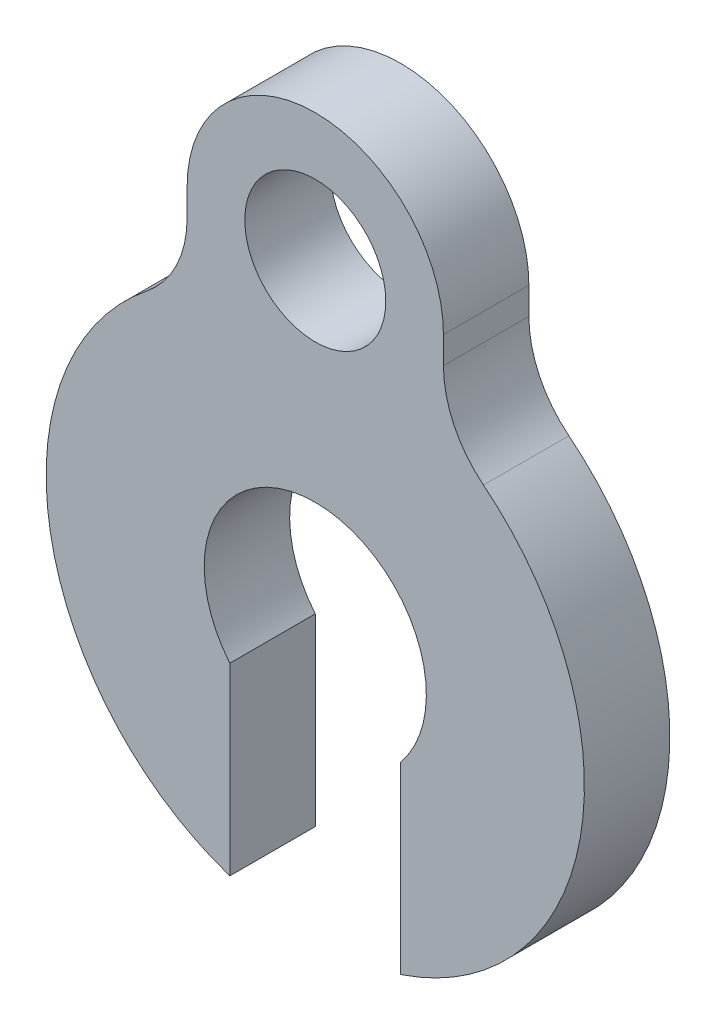
ISO-10303-21;
HEADER;
FILE_DESCRIPTION(('STEP AP214'),'2;1');
FILE_NAME('part.step','',(''),(''),'','','');
FILE_SCHEMA(('AUTOMOTIVE_DESIGN { 1 0 10303 214 1 1 1 1 }'));
ENDSEC;
DATA;
#1=APPLICATION_CONTEXT('core data for automotive mechanical design processes');
#2=APPLICATION_PROTOCOL_DEFINITION('international standard','automotive_design',2000,#1);
#3=PRODUCT_CONTEXT('',#1,'mechanical');
#4=PRODUCT('Part','Part','',(#3));
#5=PRODUCT_RELATED_PRODUCT_CATEGORY('part','',(#4));
#6=PRODUCT_DEFINITION_FORMATION('','',#4);
#7=PRODUCT_DEFINITION_CONTEXT('part definition',#1,'design');
#8=PRODUCT_DEFINITION('design','',#6,#7);
#9=PRODUCT_DEFINITION_SHAPE('','',#8);
#10=(LENGTH_UNIT() NAMED_UNIT(*) SI_UNIT(.MILLI.,.METRE.));
#11=(NAMED_UNIT(*) PLANE_ANGLE_UNIT() SI_UNIT($,.RADIAN.));
#12=(NAMED_UNIT(*) SI_UNIT($,.STERADIAN.) SOLID_ANGLE_UNIT());
#13=UNCERTAINTY_MEASURE_WITH_UNIT(LENGTH_MEASURE(1.E-05),#10,'distance_accuracy_value','');
#14=(GEOMETRIC_REPRESENTATION_CONTEXT(3) GLOBAL_UNCERTAINTY_ASSIGNED_CONTEXT((#13)) GLOBAL_UNIT_ASSIGNED_CONTEXT((#10,
#11,#12)) REPRESENTATION_CONTEXT('',''));
#15=CARTESIAN_POINT('',(0.,0.,0.));
#16=DIRECTION('',(0.,0.,1.));
#17=DIRECTION('',(1.,0.,0.));
#18=AXIS2_PLACEMENT_3D('',#15,#16,#17);
#19=CARTESIAN_POINT('',(-1.27,0.,0.635));
#20=DIRECTION('',(-1.,0.,0.));
#21=DIRECTION('',(0.,0.,1.));
#22=AXIS2_PLACEMENT_3D('',#19,#20,#21);
#23=PLANE('',#22);
#24=DIRECTION('',(0.,1.,0.));
#25=VECTOR('',#24,1.);
#26=CARTESIAN_POINT('',(-1.27,0.,-0.635));
#27=LINE('',#26,#25);
#28=CARTESIAN_POINT('',(-1.27,-3.79356036593594,-0.635));
#29=VERTEX_POINT('',#28);
#30=CARTESIAN_POINT('',(-1.27,-1.05494123059059,-0.635));
#31=VERTEX_POINT('',#30);
#32=EDGE_CURVE('E137',#29,#31,#27,.T.);
#33=ORIENTED_EDGE('',*,*,#32,.T.);
#34=DIRECTION('',(0.,0.,-1.));
#35=VECTOR('',#34,1.);
#36=CARTESIAN_POINT('',(-1.27,-1.05494123059059,0.635));
#37=LINE('',#36,#35);
#38=CARTESIAN_POINT('',(-1.27,-1.05494123059059,0.635));
#39=VERTEX_POINT('',#38);
#40=EDGE_CURVE('E118',#39,#31,#37,.T.);
#41=ORIENTED_EDGE('',*,*,#40,.F.);
#42=DIRECTION('',(0.,1.,0.));
#43=VECTOR('',#42,1.);
#44=CARTESIAN_POINT('',(-1.27,0.,0.635));
#45=LINE('',#44,#43);
#46=CARTESIAN_POINT('',(-1.27,-3.79356036593594,0.635));
#47=VERTEX_POINT('',#46);
#48=EDGE_CURVE('E125',#47,#39,#45,.T.);
#49=ORIENTED_EDGE('',*,*,#48,.F.);
#50=DIRECTION('',(0.,0.,-1.));
#51=VECTOR('',#50,1.);
#52=CARTESIAN_POINT('',(-1.27,-3.79356036593594,0.635));
#53=LINE('',#52,#51);
#54=EDGE_CURVE('E165',#47,#29,#53,.T.);
#55=ORIENTED_EDGE('',*,*,#54,.T.);
#56=EDGE_LOOP('',(#33,#41,#49,#55));
#57=FACE_BOUND('',#56,.T.);
#58=ADVANCED_FACE('F38',(#57),#23,.F.);
#59=CARTESIAN_POINT('',(0.,0.,0.635));
#60=DIRECTION('',(0.,0.,-1.));
#61=DIRECTION('',(-1.,0.,0.));
#62=AXIS2_PLACEMENT_3D('',#59,#60,#61);
#63=CYLINDRICAL_SURFACE('',#62,1.651);
#64=CARTESIAN_POINT('',(0.,0.,-0.635));
#65=DIRECTION('',(0.,0.,1.));
#66=DIRECTION('',(1.,0.,0.));
#67=AXIS2_PLACEMENT_3D('',#64,#65,#66);
#68=CIRCLE('',#67,1.651);
#69=CARTESIAN_POINT('',(1.27000000000001,-1.05494123059059,-0.635));
#70=VERTEX_POINT('',#69);
#71=EDGE_CURVE('E199',#31,#70,#68,.F.);
#72=ORIENTED_EDGE('',*,*,#71,.T.);
#73=DIRECTION('',(0.,0.,-1.));
#74=VECTOR('',#73,1.);
#75=CARTESIAN_POINT('',(1.27000000000001,-1.05494123059059,0.635));
#76=LINE('',#75,#74);
#77=CARTESIAN_POINT('',(1.27000000000001,-1.05494123059059,0.635));
#78=VERTEX_POINT('',#77);
#79=EDGE_CURVE('E120',#78,#70,#76,.T.);
#80=ORIENTED_EDGE('',*,*,#79,.F.);
#81=CARTESIAN_POINT('',(0.,0.,0.635));
#82=DIRECTION('',(0.,0.,1.));
#83=DIRECTION('',(1.,0.,0.));
#84=AXIS2_PLACEMENT_3D('',#81,#82,#83);
#85=CIRCLE('',#84,1.651);
#86=EDGE_CURVE('E113',#39,#78,#85,.F.);
#87=ORIENTED_EDGE('',*,*,#86,.F.);
#88=ORIENTED_EDGE('',*,*,#40,.T.);
#89=EDGE_LOOP('',(#72,#80,#87,#88));
#90=FACE_BOUND('',#89,.T.);
#91=ADVANCED_FACE('F116',(#90),#63,.F.);
#92=CARTESIAN_POINT('',(1.27,0.,0.635));
#93=DIRECTION('',(-1.,0.,0.));
#94=DIRECTION('',(0.,-1.,0.));
#95=AXIS2_PLACEMENT_3D('',#92,#93,#94);
#96=PLANE('',#95);
#97=DIRECTION('',(0.,1.,0.));
#98=VECTOR('',#97,1.);
#99=CARTESIAN_POINT('',(1.27,0.,-0.635));
#100=LINE('',#99,#98);
#101=CARTESIAN_POINT('',(1.27000000000003,-3.79356036593594,-0.635));
#102=VERTEX_POINT('',#101);
#103=EDGE_CURVE('E197',#102,#70,#100,.T.);
#104=ORIENTED_EDGE('',*,*,#103,.F.);
#105=DIRECTION('',(0.,0.,-1.));
#106=VECTOR('',#105,1.);
#107=CARTESIAN_POINT('',(1.27000000000003,-3.79356036593594,0.635));
#108=LINE('',#107,#106);
#109=CARTESIAN_POINT('',(1.27000000000003,-3.79356036593594,0.635));
#110=VERTEX_POINT('',#109);
#111=EDGE_CURVE('E143',#110,#102,#108,.T.);
#112=ORIENTED_EDGE('',*,*,#111,.F.);
#113=DIRECTION('',(0.,1.,0.));
#114=VECTOR('',#113,1.);
#115=CARTESIAN_POINT('',(1.27,0.,0.635));
#116=LINE('',#115,#114);
#117=EDGE_CURVE('E124',#110,#78,#116,.T.);
#118=ORIENTED_EDGE('',*,*,#117,.T.);
#119=ORIENTED_EDGE('',*,*,#79,.T.);
#120=EDGE_LOOP('',(#104,#112,#118,#119));
#121=FACE_BOUND('',#120,.T.);
#122=ADVANCED_FACE('F198',(#121),#96,.T.);
#123=CARTESIAN_POINT('',(0.,0.,0.635));
#124=DIRECTION('',(0.,0.,-1.));
#125=DIRECTION('',(-1.,0.,0.));
#126=AXIS2_PLACEMENT_3D('',#123,#124,#125);
#127=CYLINDRICAL_SURFACE('',#126,4.0005);
#128=CARTESIAN_POINT('',(0.,0.,-0.635));
#129=DIRECTION('',(0.,0.,1.));
#130=DIRECTION('',(1.,0.,0.));
#131=AXIS2_PLACEMENT_3D('',#128,#129,#130);
#132=CIRCLE('',#131,4.0005);
#133=CARTESIAN_POINT('',(2.5003125,3.1228893115741,-0.635));
#134=VERTEX_POINT('',#133);
#135=EDGE_CURVE('E193',#134,#102,#132,.F.);
#136=ORIENTED_EDGE('',*,*,#135,.F.);
#137=DIRECTION('',(0.,0.,-1.));
#138=VECTOR('',#137,1.);
#139=CARTESIAN_POINT('',(2.5003125,3.1228893115741,0.635));
#140=LINE('',#139,#138);
#141=CARTESIAN_POINT('',(2.5003125,3.1228893115741,0.635));
#142=VERTEX_POINT('',#141);
#143=EDGE_CURVE('E53',#134,#142,#140,.F.);
#144=ORIENTED_EDGE('',*,*,#143,.T.);
#145=CARTESIAN_POINT('',(0.,0.,0.635));
#146=DIRECTION('',(0.,0.,1.));
#147=DIRECTION('',(1.,0.,0.));
#148=AXIS2_PLACEMENT_3D('',#145,#146,#147);
#149=CIRCLE('',#148,4.0005);
#150=EDGE_CURVE('E194',#142,#110,#149,.F.);
#151=ORIENTED_EDGE('',*,*,#150,.T.);
#152=ORIENTED_EDGE('',*,*,#111,.T.);
#153=EDGE_LOOP('',(#136,#144,#151,#152));
#154=FACE_BOUND('',#153,.T.);
#155=ADVANCED_FACE('F192',(#154),#127,.T.);
#156=CARTESIAN_POINT('',(1.905,0.,0.635));
#157=DIRECTION('',(1.,0.,0.));
#158=DIRECTION('',(0.,0.,-1.));
#159=AXIS2_PLACEMENT_3D('',#156,#157,#158);
#160=PLANE('',#159);
#161=DIRECTION('',(0.,-1.,0.));
#162=VECTOR('',#161,1.);
#163=CARTESIAN_POINT('',(1.905,0.,0.635));
#164=LINE('',#163,#162);
#165=CARTESIAN_POINT('',(1.905,4.7625,0.635));
#166=VERTEX_POINT('',#165);
#167=CARTESIAN_POINT('',(1.905,4.36213110188129,0.635));
#168=VERTEX_POINT('',#167);
#169=EDGE_CURVE('E210',#166,#168,#164,.T.);
#170=ORIENTED_EDGE('',*,*,#169,.T.);
#171=DIRECTION('',(0.,0.,1.));
#172=VECTOR('',#171,1.);
#173=CARTESIAN_POINT('',(1.905,4.36213110188129,-0.635));
#174=LINE('',#173,#172);
#175=CARTESIAN_POINT('',(1.905,4.36213110188129,-0.635));
#176=VERTEX_POINT('',#175);
#177=EDGE_CURVE('E148',#168,#176,#174,.F.);
#178=ORIENTED_EDGE('',*,*,#177,.T.);
#179=DIRECTION('',(0.,-1.,0.));
#180=VECTOR('',#179,1.);
#181=CARTESIAN_POINT('',(1.905,0.,-0.635));
#182=LINE('',#181,#180);
#183=CARTESIAN_POINT('',(1.905,4.7625,-0.635));
#184=VERTEX_POINT('',#183);
#185=EDGE_CURVE('E182',#184,#176,#182,.T.);
#186=ORIENTED_EDGE('',*,*,#185,.F.);
#187=DIRECTION('',(0.,0.,-1.));
#188=VECTOR('',#187,1.);
#189=CARTESIAN_POINT('',(1.905,4.7625,0.635));
#190=LINE('',#189,#188);
#191=EDGE_CURVE('E188',#166,#184,#190,.T.);
#192=ORIENTED_EDGE('',*,*,#191,.F.);
#193=EDGE_LOOP('',(#170,#178,#186,#192));
#194=FACE_BOUND('',#193,.T.);
#195=ADVANCED_FACE('F207',(#194),#160,.T.);
#196=CARTESIAN_POINT('',(0.,4.7625,0.635));
#197=DIRECTION('',(0.,0.,-1.));
#198=DIRECTION('',(-1.,0.,0.));
#199=AXIS2_PLACEMENT_3D('',#196,#197,#198);
#200=CYLINDRICAL_SURFACE('',#199,1.905);
#201=CARTESIAN_POINT('',(0.,4.7625,-0.635));
#202=DIRECTION('',(0.,0.,1.));
#203=DIRECTION('',(1.,0.,0.));
#204=AXIS2_PLACEMENT_3D('',#201,#202,#203);
#205=CIRCLE('',#204,1.905);
#206=CARTESIAN_POINT('',(-1.905,4.7625,-0.635));
#207=VERTEX_POINT('',#206);
#208=EDGE_CURVE('E179',#207,#184,#205,.F.);
#209=ORIENTED_EDGE('',*,*,#208,.F.);
#210=DIRECTION('',(0.,0.,-1.));
#211=VECTOR('',#210,1.);
#212=CARTESIAN_POINT('',(-1.905,4.7625,0.635));
#213=LINE('',#212,#211);
#214=CARTESIAN_POINT('',(-1.905,4.7625,0.635));
#215=VERTEX_POINT('',#214);
#216=EDGE_CURVE('E177',#215,#207,#213,.T.);
#217=ORIENTED_EDGE('',*,*,#216,.F.);
#218=CARTESIAN_POINT('',(0.,4.7625,0.635));
#219=DIRECTION('',(0.,0.,1.));
#220=DIRECTION('',(1.,0.,0.));
#221=AXIS2_PLACEMENT_3D('',#218,#219,#220);
#222=CIRCLE('',#221,1.905);
#223=EDGE_CURVE('E215',#215,#166,#222,.F.);
#224=ORIENTED_EDGE('',*,*,#223,.T.);
#225=ORIENTED_EDGE('',*,*,#191,.T.);
#226=EDGE_LOOP('',(#209,#217,#224,#225));
#227=FACE_BOUND('',#226,.T.);
#228=ADVANCED_FACE('F235',(#227),#200,.T.);
#229=CARTESIAN_POINT('',(-1.905,0.,0.635));
#230=DIRECTION('',(-1.,0.,0.));
#231=DIRECTION('',(0.,0.,1.));
#232=AXIS2_PLACEMENT_3D('',#229,#230,#231);
#233=PLANE('',#232);
#234=DIRECTION('',(0.,1.,0.));
#235=VECTOR('',#234,1.);
#236=CARTESIAN_POINT('',(-1.905,0.,-0.635));
#237=LINE('',#236,#235);
#238=CARTESIAN_POINT('',(-1.905,4.36213110188128,-0.635));
#239=VERTEX_POINT('',#238);
#240=EDGE_CURVE('E171',#239,#207,#237,.T.);
#241=ORIENTED_EDGE('',*,*,#240,.F.);
#242=DIRECTION('',(0.,0.,-1.));
#243=VECTOR('',#242,1.);
#244=CARTESIAN_POINT('',(-1.905,4.36213110188128,0.635));
#245=LINE('',#244,#243);
#246=CARTESIAN_POINT('',(-1.905,4.36213110188128,0.635));
#247=VERTEX_POINT('',#246);
#248=EDGE_CURVE('E141',#239,#247,#245,.F.);
#249=ORIENTED_EDGE('',*,*,#248,.T.);
#250=DIRECTION('',(0.,1.,0.));
#251=VECTOR('',#250,1.);
#252=CARTESIAN_POINT('',(-1.905,0.,0.635));
#253=LINE('',#252,#251);
#254=EDGE_CURVE('E158',#247,#215,#253,.T.);
#255=ORIENTED_EDGE('',*,*,#254,.T.);
#256=ORIENTED_EDGE('',*,*,#216,.T.);
#257=EDGE_LOOP('',(#241,#249,#255,#256));
#258=FACE_BOUND('',#257,.T.);
#259=ADVANCED_FACE('F175',(#258),#233,.T.);
#260=CARTESIAN_POINT('',(0.,4.7625,0.635));
#261=DIRECTION('',(0.,0.,-1.));
#262=DIRECTION('',(-1.,0.,0.));
#263=AXIS2_PLACEMENT_3D('',#260,#261,#262);
#264=CYLINDRICAL_SURFACE('',#263,1.04775);
#265=CARTESIAN_POINT('',(0.,4.7625,0.635));
#266=DIRECTION('',(0.,0.,1.));
#267=DIRECTION('',(1.,0.,0.));
#268=AXIS2_PLACEMENT_3D('',#265,#266,#267);
#269=CIRCLE('',#268,1.04775);
#270=CARTESIAN_POINT('',(1.04775,4.7625,0.635));
#271=VERTEX_POINT('',#270);
#272=EDGE_CURVE('E134',#271,#271,#269,.T.);
#273=ORIENTED_EDGE('',*,*,#272,.T.);
#274=EDGE_LOOP('',(#273));
#275=FACE_BOUND('',#274,.T.);
#276=CARTESIAN_POINT('',(0.,4.7625,-0.635));
#277=DIRECTION('',(0.,0.,1.));
#278=DIRECTION('',(1.,0.,0.));
#279=AXIS2_PLACEMENT_3D('',#276,#277,#278);
#280=CIRCLE('',#279,1.04775);
#281=CARTESIAN_POINT('',(1.04775,4.7625,-0.635));
#282=VERTEX_POINT('',#281);
#283=EDGE_CURVE('E221',#282,#282,#280,.T.);
#284=ORIENTED_EDGE('',*,*,#283,.F.);
#285=EDGE_LOOP('',(#284));
#286=FACE_BOUND('',#285,.T.);
#287=ADVANCED_FACE('F226',(#275,#286),#264,.F.);
#288=CARTESIAN_POINT('',(0.,0.,0.635));
#289=DIRECTION('',(0.,0.,-1.));
#290=DIRECTION('',(-1.,0.,0.));
#291=AXIS2_PLACEMENT_3D('',#288,#289,#290);
#292=CYLINDRICAL_SURFACE('',#291,4.0005);
#293=CARTESIAN_POINT('',(0.,0.,0.635));
#294=DIRECTION('',(0.,0.,1.));
#295=DIRECTION('',(1.,0.,0.));
#296=AXIS2_PLACEMENT_3D('',#293,#294,#295);
#297=CIRCLE('',#296,4.0005);
#298=CARTESIAN_POINT('',(-2.5003125,3.1228893115741,0.635));
#299=VERTEX_POINT('',#298);
#300=EDGE_CURVE('E130',#299,#47,#297,.T.);
#301=ORIENTED_EDGE('',*,*,#300,.F.);
#302=DIRECTION('',(0.,0.,-1.));
#303=VECTOR('',#302,1.);
#304=CARTESIAN_POINT('',(-2.5003125,3.1228893115741,0.635));
#305=LINE('',#304,#303);
#306=CARTESIAN_POINT('',(-2.5003125,3.1228893115741,-0.635));
#307=VERTEX_POINT('',#306);
#308=EDGE_CURVE('E138',#299,#307,#305,.T.);
#309=ORIENTED_EDGE('',*,*,#308,.T.);
#310=CARTESIAN_POINT('',(0.,0.,-0.635));
#311=DIRECTION('',(0.,0.,1.));
#312=DIRECTION('',(1.,0.,0.));
#313=AXIS2_PLACEMENT_3D('',#310,#311,#312);
#314=CIRCLE('',#313,4.0005);
#315=EDGE_CURVE('E173',#307,#29,#314,.T.);
#316=ORIENTED_EDGE('',*,*,#315,.T.);
#317=ORIENTED_EDGE('',*,*,#54,.F.);
#318=EDGE_LOOP('',(#301,#309,#316,#317));
#319=FACE_BOUND('',#318,.T.);
#320=ADVANCED_FACE('F163',(#319),#292,.T.);
#321=CARTESIAN_POINT('',(0.,0.,0.635));
#322=DIRECTION('',(0.,0.,1.));
#323=DIRECTION('',(1.,0.,0.));
#324=AXIS2_PLACEMENT_3D('',#321,#322,#323);
#325=PLANE('',#324);
#326=ORIENTED_EDGE('',*,*,#272,.F.);
#327=EDGE_LOOP('',(#326));
#328=FACE_BOUND('',#327,.T.);
#329=ORIENTED_EDGE('',*,*,#48,.T.);
#330=ORIENTED_EDGE('',*,*,#86,.T.);
#331=ORIENTED_EDGE('',*,*,#117,.F.);
#332=ORIENTED_EDGE('',*,*,#150,.F.);
#333=CARTESIAN_POINT('',(3.4925,4.36213110188129,0.635));
#334=DIRECTION('',(0.,0.,1.));
#335=DIRECTION('',(1.,0.,0.));
#336=AXIS2_PLACEMENT_3D('',#333,#334,#335);
#337=CIRCLE('',#336,1.5875);
#338=EDGE_CURVE('E12',#142,#168,#337,.F.);
#339=ORIENTED_EDGE('',*,*,#338,.T.);
#340=ORIENTED_EDGE('',*,*,#169,.F.);
#341=ORIENTED_EDGE('',*,*,#223,.F.);
#342=ORIENTED_EDGE('',*,*,#254,.F.);
#343=CARTESIAN_POINT('',(-3.4925,4.36213110188128,0.635));
#344=DIRECTION('',(0.,0.,1.));
#345=DIRECTION('',(1.,0.,0.));
#346=AXIS2_PLACEMENT_3D('',#343,#344,#345);
#347=CIRCLE('',#346,1.5875);
#348=EDGE_CURVE('E154',#247,#299,#347,.F.);
#349=ORIENTED_EDGE('',*,*,#348,.T.);
#350=ORIENTED_EDGE('',*,*,#300,.T.);
#351=EDGE_LOOP('',(#329,#330,#331,#332,#339,#340,#341,#342,#349,#350));
#352=FACE_BOUND('',#351,.T.);
#353=ADVANCED_FACE('F128',(#328,#352),#325,.T.);
#354=CARTESIAN_POINT('',(0.,0.,-0.635));
#355=DIRECTION('',(0.,0.,1.));
#356=DIRECTION('',(1.,0.,0.));
#357=AXIS2_PLACEMENT_3D('',#354,#355,#356);
#358=PLANE('',#357);
#359=ORIENTED_EDGE('',*,*,#283,.T.);
#360=EDGE_LOOP('',(#359));
#361=FACE_BOUND('',#360,.T.);
#362=ORIENTED_EDGE('',*,*,#32,.F.);
#363=ORIENTED_EDGE('',*,*,#315,.F.);
#364=CARTESIAN_POINT('',(-3.4925,4.36213110188128,-0.635));
#365=DIRECTION('',(0.,0.,1.));
#366=DIRECTION('',(1.,0.,0.));
#367=AXIS2_PLACEMENT_3D('',#364,#365,#366);
#368=CIRCLE('',#367,1.5875);
#369=EDGE_CURVE('E152',#307,#239,#368,.T.);
#370=ORIENTED_EDGE('',*,*,#369,.T.);
#371=ORIENTED_EDGE('',*,*,#240,.T.);
#372=ORIENTED_EDGE('',*,*,#208,.T.);
#373=ORIENTED_EDGE('',*,*,#185,.T.);
#374=CARTESIAN_POINT('',(3.4925,4.36213110188129,-0.635));
#375=DIRECTION('',(0.,0.,1.));
#376=DIRECTION('',(1.,0.,0.));
#377=AXIS2_PLACEMENT_3D('',#374,#375,#376);
#378=CIRCLE('',#377,1.5875);
#379=EDGE_CURVE('E46',#176,#134,#378,.T.);
#380=ORIENTED_EDGE('',*,*,#379,.T.);
#381=ORIENTED_EDGE('',*,*,#135,.T.);
#382=ORIENTED_EDGE('',*,*,#103,.T.);
#383=ORIENTED_EDGE('',*,*,#71,.F.);
#384=EDGE_LOOP('',(#362,#363,#370,#371,#372,#373,#380,#381,#382,#383));
#385=FACE_BOUND('',#384,.T.);
#386=ADVANCED_FACE('F169',(#361,#385),#358,.F.);
#387=CARTESIAN_POINT('',(-3.4925,4.36213110188128,0.635));
#388=DIRECTION('',(0.,0.,-1.));
#389=DIRECTION('',(-1.,0.,0.));
#390=AXIS2_PLACEMENT_3D('',#387,#388,#389);
#391=CYLINDRICAL_SURFACE('',#390,1.5875);
#392=ORIENTED_EDGE('',*,*,#348,.F.);
#393=ORIENTED_EDGE('',*,*,#248,.F.);
#394=ORIENTED_EDGE('',*,*,#369,.F.);
#395=ORIENTED_EDGE('',*,*,#308,.F.);
#396=EDGE_LOOP('',(#392,#393,#394,#395));
#397=FACE_BOUND('',#396,.T.);
#398=ADVANCED_FACE('F167',(#397),#391,.F.);
#399=CARTESIAN_POINT('',(3.4925,4.36213110188129,0.635));
#400=DIRECTION('',(0.,0.,-1.));
#401=DIRECTION('',(-1.,0.,0.));
#402=AXIS2_PLACEMENT_3D('',#399,#400,#401);
#403=CYLINDRICAL_SURFACE('',#402,1.5875);
#404=ORIENTED_EDGE('',*,*,#338,.F.);
#405=ORIENTED_EDGE('',*,*,#143,.F.);
#406=ORIENTED_EDGE('',*,*,#379,.F.);
#407=ORIENTED_EDGE('',*,*,#177,.F.);
#408=EDGE_LOOP('',(#404,#405,#406,#407));
#409=FACE_BOUND('',#408,.T.);
#410=ADVANCED_FACE('F40',(#409),#403,.F.);
#411=CLOSED_SHELL('',(#58,#91,#122,#155,#195,#228,#259,#287,#320,#353,#386,#398,#410));
#412=MANIFOLD_SOLID_BREP('B2',#411);
#413=ADVANCED_BREP_SHAPE_REPRESENTATION('',(#18,#412),#14);
#414=SHAPE_DEFINITION_REPRESENTATION(#9,#413);
ENDSEC;
END-ISO-10303-21;
